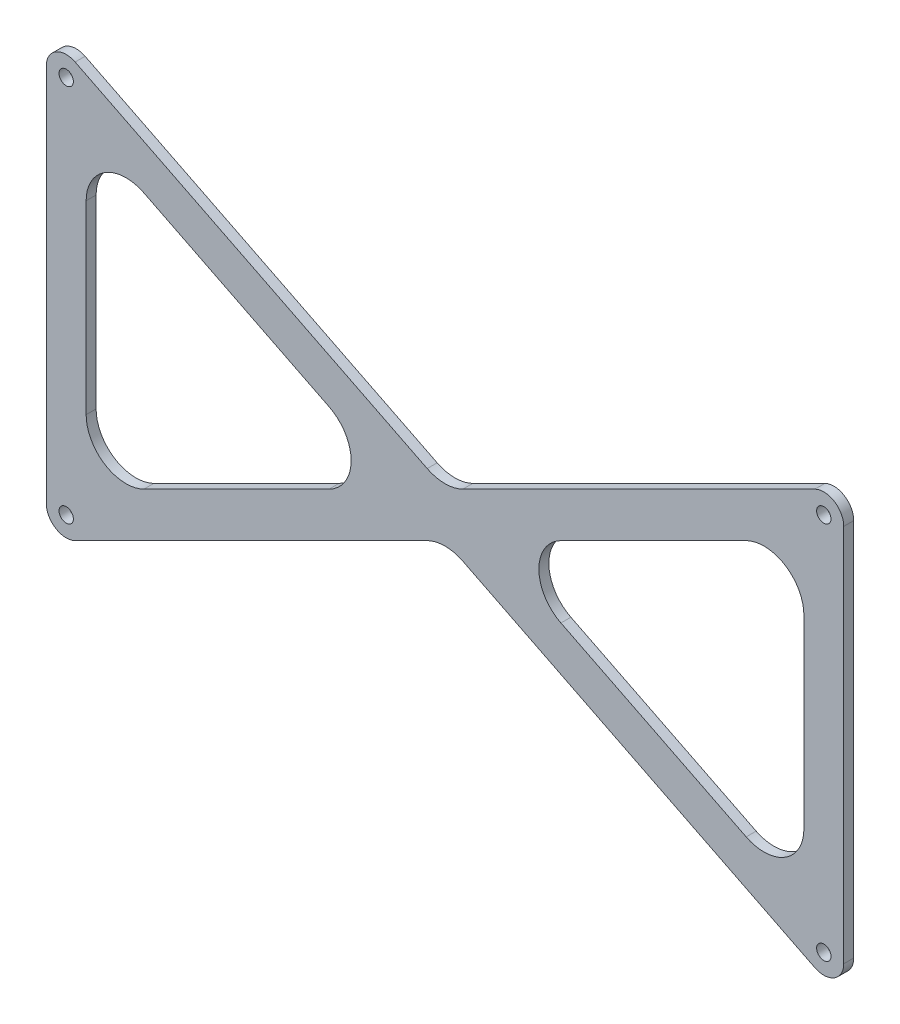
ISO-10303-21;
HEADER;
FILE_DESCRIPTION(('STEP AP214'),'2;1');
FILE_NAME('part.step','',(''),(''),'','','');
FILE_SCHEMA(('AUTOMOTIVE_DESIGN { 1 0 10303 214 1 1 1 1 }'));
ENDSEC;
DATA;
#1=APPLICATION_CONTEXT('core data for automotive mechanical design processes');
#2=APPLICATION_PROTOCOL_DEFINITION('international standard','automotive_design',2000,#1);
#3=PRODUCT_CONTEXT('',#1,'mechanical');
#4=PRODUCT('Part','Part','',(#3));
#5=PRODUCT_RELATED_PRODUCT_CATEGORY('part','',(#4));
#6=PRODUCT_DEFINITION_FORMATION('','',#4);
#7=PRODUCT_DEFINITION_CONTEXT('part definition',#1,'design');
#8=PRODUCT_DEFINITION('design','',#6,#7);
#9=PRODUCT_DEFINITION_SHAPE('','',#8);
#10=(LENGTH_UNIT() NAMED_UNIT(*) SI_UNIT(.MILLI.,.METRE.));
#11=(NAMED_UNIT(*) PLANE_ANGLE_UNIT() SI_UNIT($,.RADIAN.));
#12=(NAMED_UNIT(*) SI_UNIT($,.STERADIAN.) SOLID_ANGLE_UNIT());
#13=UNCERTAINTY_MEASURE_WITH_UNIT(LENGTH_MEASURE(1.E-05),#10,'distance_accuracy_value','');
#14=(GEOMETRIC_REPRESENTATION_CONTEXT(3) GLOBAL_UNCERTAINTY_ASSIGNED_CONTEXT((#13)) GLOBAL_UNIT_ASSIGNED_CONTEXT((#10,
#11,#12)) REPRESENTATION_CONTEXT('',''));
#15=CARTESIAN_POINT('',(0.,0.,0.));
#16=DIRECTION('',(0.,0.,1.));
#17=DIRECTION('',(1.,0.,0.));
#18=AXIS2_PLACEMENT_3D('',#15,#16,#17);
#19=CARTESIAN_POINT('',(120.65,60.325,3.175));
#20=DIRECTION('',(0.,0.,1.));
#21=DIRECTION('',(1.,0.,0.));
#22=AXIS2_PLACEMENT_3D('',#19,#20,#21);
#23=PLANE('',#22);
#24=CARTESIAN_POINT('',(120.65,60.325,3.175));
#25=DIRECTION('',(0.,0.,1.));
#26=DIRECTION('',(1.,0.,0.));
#27=AXIS2_PLACEMENT_3D('',#24,#25,#26);
#28=CIRCLE('',#27,2.28599999999999);
#29=CARTESIAN_POINT('',(122.936,60.325,3.175));
#30=VERTEX_POINT('',#29);
#31=EDGE_CURVE('E767',#30,#30,#28,.T.);
#32=ORIENTED_EDGE('',*,*,#31,.F.);
#33=EDGE_LOOP('',(#32));
#34=FACE_BOUND('',#33,.T.);
#35=CARTESIAN_POINT('',(120.65,-60.325,3.175));
#36=DIRECTION('',(0.,0.,1.));
#37=DIRECTION('',(1.,0.,0.));
#38=AXIS2_PLACEMENT_3D('',#35,#36,#37);
#39=CIRCLE('',#38,2.28599999999999);
#40=CARTESIAN_POINT('',(122.936,-60.325,3.175));
#41=VERTEX_POINT('',#40);
#42=EDGE_CURVE('E772',#41,#41,#39,.T.);
#43=ORIENTED_EDGE('',*,*,#42,.F.);
#44=EDGE_LOOP('',(#43));
#45=FACE_BOUND('',#44,.T.);
#46=CARTESIAN_POINT('',(-120.65,-60.325,3.175));
#47=DIRECTION('',(0.,0.,1.));
#48=DIRECTION('',(1.,0.,0.));
#49=AXIS2_PLACEMENT_3D('',#46,#47,#48);
#50=CIRCLE('',#49,2.28599999999999);
#51=CARTESIAN_POINT('',(-118.364,-60.325,3.175));
#52=VERTEX_POINT('',#51);
#53=EDGE_CURVE('E780',#52,#52,#50,.T.);
#54=ORIENTED_EDGE('',*,*,#53,.F.);
#55=EDGE_LOOP('',(#54));
#56=FACE_BOUND('',#55,.T.);
#57=CARTESIAN_POINT('',(-120.65,60.325,3.175));
#58=DIRECTION('',(0.,0.,1.));
#59=DIRECTION('',(1.,0.,0.));
#60=AXIS2_PLACEMENT_3D('',#57,#58,#59);
#61=CIRCLE('',#60,2.28599999999999);
#62=CARTESIAN_POINT('',(-118.364,60.325,3.175));
#63=VERTEX_POINT('',#62);
#64=EDGE_CURVE('E336',#63,#63,#61,.T.);
#65=ORIENTED_EDGE('',*,*,#64,.F.);
#66=EDGE_LOOP('',(#65));
#67=FACE_BOUND('',#66,.T.);
#68=CARTESIAN_POINT('',(120.65,60.325,3.175));
#69=DIRECTION('',(0.,0.,1.));
#70=DIRECTION('',(1.,0.,0.));
#71=AXIS2_PLACEMENT_3D('',#68,#69,#70);
#72=CIRCLE('',#71,6.34999999999999);
#73=CARTESIAN_POINT('',(127.,60.325,3.175));
#74=VERTEX_POINT('',#73);
#75=CARTESIAN_POINT('',(117.810193668575,66.0046126628494,3.175));
#76=VERTEX_POINT('',#75);
#77=EDGE_CURVE('E224',#74,#76,#72,.T.);
#78=ORIENTED_EDGE('',*,*,#77,.T.);
#79=DIRECTION('',(-0.894427190999916,-0.447213595499958,0.));
#80=VECTOR('',#79,1.);
#81=CARTESIAN_POINT('',(0.,7.09951582856184,3.175));
#82=LINE('',#81,#80);
#83=CARTESIAN_POINT('',(5.67961266284947,9.93932215998657,3.175));
#84=VERTEX_POINT('',#83);
#85=EDGE_CURVE('E212',#76,#84,#82,.T.);
#86=ORIENTED_EDGE('',*,*,#85,.T.);
#87=CARTESIAN_POINT('',(0.,21.2985474856855,3.175));
#88=DIRECTION('',(0.,0.,1.));
#89=DIRECTION('',(1.,0.,0.));
#90=AXIS2_PLACEMENT_3D('',#87,#88,#89);
#91=CIRCLE('',#90,12.7);
#92=CARTESIAN_POINT('',(-5.67961266284944,9.93932215998657,3.175));
#93=VERTEX_POINT('',#92);
#94=EDGE_CURVE('E285',#84,#93,#91,.F.);
#95=ORIENTED_EDGE('',*,*,#94,.T.);
#96=DIRECTION('',(-0.894427190999916,0.447213595499958,0.));
#97=VECTOR('',#96,1.);
#98=CARTESIAN_POINT('',(-117.810193668575,66.0046126628495,3.175));
#99=LINE('',#98,#97);
#100=CARTESIAN_POINT('',(-117.810193668575,66.0046126628495,3.175));
#101=VERTEX_POINT('',#100);
#102=EDGE_CURVE('E223',#93,#101,#99,.T.);
#103=ORIENTED_EDGE('',*,*,#102,.T.);
#104=CARTESIAN_POINT('',(-120.65,60.325,3.175));
#105=DIRECTION('',(0.,0.,1.));
#106=DIRECTION('',(1.,0.,0.));
#107=AXIS2_PLACEMENT_3D('',#104,#105,#106);
#108=CIRCLE('',#107,6.35);
#109=CARTESIAN_POINT('',(-127.,60.325,3.175));
#110=VERTEX_POINT('',#109);
#111=EDGE_CURVE('E364',#101,#110,#108,.T.);
#112=ORIENTED_EDGE('',*,*,#111,.T.);
#113=DIRECTION('',(0.,-1.,0.));
#114=VECTOR('',#113,1.);
#115=CARTESIAN_POINT('',(-127.,60.325,3.175));
#116=LINE('',#115,#114);
#117=CARTESIAN_POINT('',(-127.,-60.325,3.175));
#118=VERTEX_POINT('',#117);
#119=EDGE_CURVE('E366',#110,#118,#116,.T.);
#120=ORIENTED_EDGE('',*,*,#119,.T.);
#121=CARTESIAN_POINT('',(-120.65,-60.325,3.175));
#122=DIRECTION('',(0.,0.,1.));
#123=DIRECTION('',(1.,0.,0.));
#124=AXIS2_PLACEMENT_3D('',#121,#122,#123);
#125=CIRCLE('',#124,6.34999999999998);
#126=CARTESIAN_POINT('',(-117.810193668575,-66.0046126628494,3.175));
#127=VERTEX_POINT('',#126);
#128=EDGE_CURVE('E369',#118,#127,#125,.T.);
#129=ORIENTED_EDGE('',*,*,#128,.T.);
#130=DIRECTION('',(0.894427190999916,0.447213595499958,0.));
#131=VECTOR('',#130,1.);
#132=CARTESIAN_POINT('',(-117.810193668575,-66.0046126628495,3.175));
#133=LINE('',#132,#131);
#134=CARTESIAN_POINT('',(-5.67961266284943,-9.93932215998656,3.175));
#135=VERTEX_POINT('',#134);
#136=EDGE_CURVE('E372',#127,#135,#133,.T.);
#137=ORIENTED_EDGE('',*,*,#136,.T.);
#138=CARTESIAN_POINT('',(0.,-21.2985474856855,3.175));
#139=DIRECTION('',(0.,0.,1.));
#140=DIRECTION('',(1.,0.,0.));
#141=AXIS2_PLACEMENT_3D('',#138,#139,#140);
#142=CIRCLE('',#141,12.7);
#143=CARTESIAN_POINT('',(5.67961266284949,-9.93932215998657,3.175));
#144=VERTEX_POINT('',#143);
#145=EDGE_CURVE('E289',#135,#144,#142,.F.);
#146=ORIENTED_EDGE('',*,*,#145,.T.);
#147=DIRECTION('',(0.894427190999916,-0.447213595499958,0.));
#148=VECTOR('',#147,1.);
#149=CARTESIAN_POINT('',(0.,-7.09951582856183,3.175));
#150=LINE('',#149,#148);
#151=CARTESIAN_POINT('',(117.810193668575,-66.0046126628495,3.175));
#152=VERTEX_POINT('',#151);
#153=EDGE_CURVE('E376',#144,#152,#150,.T.);
#154=ORIENTED_EDGE('',*,*,#153,.T.);
#155=CARTESIAN_POINT('',(120.65,-60.325,3.175));
#156=DIRECTION('',(0.,0.,1.));
#157=DIRECTION('',(1.,0.,0.));
#158=AXIS2_PLACEMENT_3D('',#155,#156,#157);
#159=CIRCLE('',#158,6.35000000000001);
#160=CARTESIAN_POINT('',(127.,-60.325,3.175));
#161=VERTEX_POINT('',#160);
#162=EDGE_CURVE('E379',#152,#161,#159,.T.);
#163=ORIENTED_EDGE('',*,*,#162,.T.);
#164=DIRECTION('',(0.,1.,0.));
#165=VECTOR('',#164,1.);
#166=CARTESIAN_POINT('',(127.,60.325,3.175));
#167=LINE('',#166,#165);
#168=EDGE_CURVE('E229',#161,#74,#167,.T.);
#169=ORIENTED_EDGE('',*,*,#168,.T.);
#170=EDGE_LOOP('',(#78,#86,#95,#103,#112,#120,#129,#137,#146,#154,#163,#169));
#171=FACE_BOUND('',#170,.T.);
#172=DIRECTION('',(-0.894427190999916,-0.447213595499958,0.));
#173=VECTOR('',#172,1.);
#174=CARTESIAN_POINT('',(14.1990316571237,0.,3.175));
#175=LINE('',#174,#173);
#176=CARTESIAN_POINT('',(95.9203873371505,40.8606778400134,3.175));
#177=VERTEX_POINT('',#176);
#178=CARTESIAN_POINT('',(36.9174823085215,11.3592253256989,3.175));
#179=VERTEX_POINT('',#178);
#180=EDGE_CURVE('E347',#177,#179,#175,.T.);
#181=ORIENTED_EDGE('',*,*,#180,.F.);
#182=CARTESIAN_POINT('',(101.6,29.5014525143145,3.175));
#183=DIRECTION('',(0.,0.,1.));
#184=DIRECTION('',(1.,0.,0.));
#185=AXIS2_PLACEMENT_3D('',#182,#183,#184);
#186=CIRCLE('',#185,12.7);
#187=CARTESIAN_POINT('',(114.3,29.5014525143145,3.175));
#188=VERTEX_POINT('',#187);
#189=EDGE_CURVE('E297',#177,#188,#186,.F.);
#190=ORIENTED_EDGE('',*,*,#189,.T.);
#191=DIRECTION('',(0.,1.,0.));
#192=VECTOR('',#191,1.);
#193=CARTESIAN_POINT('',(114.3,50.0504841714381,3.175));
#194=LINE('',#193,#192);
#195=CARTESIAN_POINT('',(114.3,-29.5014525143145,3.175));
#196=VERTEX_POINT('',#195);
#197=EDGE_CURVE('E344',#196,#188,#194,.T.);
#198=ORIENTED_EDGE('',*,*,#197,.F.);
#199=CARTESIAN_POINT('',(101.6,-29.5014525143145,3.175));
#200=DIRECTION('',(0.,0.,1.));
#201=DIRECTION('',(1.,0.,0.));
#202=AXIS2_PLACEMENT_3D('',#199,#200,#201);
#203=CIRCLE('',#202,12.7);
#204=CARTESIAN_POINT('',(95.9203873371505,-40.8606778400135,3.175));
#205=VERTEX_POINT('',#204);
#206=EDGE_CURVE('E293',#196,#205,#203,.F.);
#207=ORIENTED_EDGE('',*,*,#206,.T.);
#208=DIRECTION('',(0.894427190999916,-0.447213595499958,0.));
#209=VECTOR('',#208,1.);
#210=CARTESIAN_POINT('',(14.1990316571237,0.,3.175));
#211=LINE('',#210,#209);
#212=CARTESIAN_POINT('',(36.9174823085215,-11.3592253256989,3.175));
#213=VERTEX_POINT('',#212);
#214=EDGE_CURVE('E351',#213,#205,#211,.T.);
#215=ORIENTED_EDGE('',*,*,#214,.F.);
#216=CARTESIAN_POINT('',(42.597094971371,0.,3.175));
#217=DIRECTION('',(0.,0.,1.));
#218=DIRECTION('',(1.,0.,0.));
#219=AXIS2_PLACEMENT_3D('',#216,#217,#218);
#220=CIRCLE('',#219,12.7);
#221=EDGE_CURVE('E301',#213,#179,#220,.F.);
#222=ORIENTED_EDGE('',*,*,#221,.T.);
#223=EDGE_LOOP('',(#181,#190,#198,#207,#215,#222));
#224=FACE_BOUND('',#223,.T.);
#225=DIRECTION('',(0.,-1.,0.));
#226=VECTOR('',#225,1.);
#227=CARTESIAN_POINT('',(-114.3,50.0504841714382,3.175));
#228=LINE('',#227,#226);
#229=CARTESIAN_POINT('',(-114.3,29.5014525143145,3.175));
#230=VERTEX_POINT('',#229);
#231=CARTESIAN_POINT('',(-114.3,-29.5014525143145,3.175));
#232=VERTEX_POINT('',#231);
#233=EDGE_CURVE('E330',#230,#232,#228,.T.);
#234=ORIENTED_EDGE('',*,*,#233,.F.);
#235=CARTESIAN_POINT('',(-101.6,29.5014525143145,3.175));
#236=DIRECTION('',(0.,0.,1.));
#237=DIRECTION('',(1.,0.,0.));
#238=AXIS2_PLACEMENT_3D('',#235,#236,#237);
#239=CIRCLE('',#238,12.7);
#240=CARTESIAN_POINT('',(-95.9203873371505,40.8606778400135,3.175));
#241=VERTEX_POINT('',#240);
#242=EDGE_CURVE('E11',#230,#241,#239,.F.);
#243=ORIENTED_EDGE('',*,*,#242,.T.);
#244=DIRECTION('',(-0.894427190999916,0.447213595499958,0.));
#245=VECTOR('',#244,1.);
#246=CARTESIAN_POINT('',(-114.3,50.0504841714382,3.175));
#247=LINE('',#246,#245);
#248=CARTESIAN_POINT('',(-36.9174823085215,11.3592253256989,3.175));
#249=VERTEX_POINT('',#248);
#250=EDGE_CURVE('E328',#249,#241,#247,.T.);
#251=ORIENTED_EDGE('',*,*,#250,.F.);
#252=CARTESIAN_POINT('',(-42.597094971371,0.,3.175));
#253=DIRECTION('',(0.,0.,1.));
#254=DIRECTION('',(1.,0.,0.));
#255=AXIS2_PLACEMENT_3D('',#252,#253,#254);
#256=CIRCLE('',#255,12.7);
#257=CARTESIAN_POINT('',(-36.9174823085215,-11.3592253256989,3.175));
#258=VERTEX_POINT('',#257);
#259=EDGE_CURVE('E309',#249,#258,#256,.F.);
#260=ORIENTED_EDGE('',*,*,#259,.T.);
#261=DIRECTION('',(0.894427190999916,0.447213595499958,0.));
#262=VECTOR('',#261,1.);
#263=CARTESIAN_POINT('',(-114.3,-50.0504841714381,3.175));
#264=LINE('',#263,#262);
#265=CARTESIAN_POINT('',(-95.9203873371505,-40.8606778400134,3.175));
#266=VERTEX_POINT('',#265);
#267=EDGE_CURVE('E332',#266,#258,#264,.T.);
#268=ORIENTED_EDGE('',*,*,#267,.F.);
#269=CARTESIAN_POINT('',(-101.6,-29.5014525143145,3.175));
#270=DIRECTION('',(0.,0.,1.));
#271=DIRECTION('',(1.,0.,0.));
#272=AXIS2_PLACEMENT_3D('',#269,#270,#271);
#273=CIRCLE('',#272,12.7);
#274=EDGE_CURVE('E305',#266,#232,#273,.F.);
#275=ORIENTED_EDGE('',*,*,#274,.T.);
#276=EDGE_LOOP('',(#234,#243,#251,#260,#268,#275));
#277=FACE_BOUND('',#276,.T.);
#278=ADVANCED_FACE('F43',(#34,#45,#56,#67,#171,#224,#277),#23,.T.);
#279=CARTESIAN_POINT('',(120.65,60.325,0.));
#280=DIRECTION('',(0.,0.,1.));
#281=DIRECTION('',(1.,0.,0.));
#282=AXIS2_PLACEMENT_3D('',#279,#280,#281);
#283=PLANE('',#282);
#284=CARTESIAN_POINT('',(120.65,60.325,0.));
#285=DIRECTION('',(0.,0.,1.));
#286=DIRECTION('',(1.,0.,0.));
#287=AXIS2_PLACEMENT_3D('',#284,#285,#286);
#288=CIRCLE('',#287,2.28599999999999);
#289=CARTESIAN_POINT('',(122.936,60.325,0.));
#290=VERTEX_POINT('',#289);
#291=EDGE_CURVE('E765',#290,#290,#288,.T.);
#292=ORIENTED_EDGE('',*,*,#291,.T.);
#293=EDGE_LOOP('',(#292));
#294=FACE_BOUND('',#293,.T.);
#295=CARTESIAN_POINT('',(120.65,-60.325,0.));
#296=DIRECTION('',(0.,0.,1.));
#297=DIRECTION('',(1.,0.,0.));
#298=AXIS2_PLACEMENT_3D('',#295,#296,#297);
#299=CIRCLE('',#298,2.28599999999999);
#300=CARTESIAN_POINT('',(122.936,-60.325,0.));
#301=VERTEX_POINT('',#300);
#302=EDGE_CURVE('E768',#301,#301,#299,.T.);
#303=ORIENTED_EDGE('',*,*,#302,.T.);
#304=EDGE_LOOP('',(#303));
#305=FACE_BOUND('',#304,.T.);
#306=CARTESIAN_POINT('',(-120.65,-60.325,0.));
#307=DIRECTION('',(0.,0.,1.));
#308=DIRECTION('',(1.,0.,0.));
#309=AXIS2_PLACEMENT_3D('',#306,#307,#308);
#310=CIRCLE('',#309,2.28599999999999);
#311=CARTESIAN_POINT('',(-118.364,-60.325,0.));
#312=VERTEX_POINT('',#311);
#313=EDGE_CURVE('E785',#312,#312,#310,.T.);
#314=ORIENTED_EDGE('',*,*,#313,.T.);
#315=EDGE_LOOP('',(#314));
#316=FACE_BOUND('',#315,.T.);
#317=CARTESIAN_POINT('',(-120.65,60.325,0.));
#318=DIRECTION('',(0.,0.,1.));
#319=DIRECTION('',(1.,0.,0.));
#320=AXIS2_PLACEMENT_3D('',#317,#318,#319);
#321=CIRCLE('',#320,2.28599999999999);
#322=CARTESIAN_POINT('',(-118.364,60.325,0.));
#323=VERTEX_POINT('',#322);
#324=EDGE_CURVE('E342',#323,#323,#321,.T.);
#325=ORIENTED_EDGE('',*,*,#324,.T.);
#326=EDGE_LOOP('',(#325));
#327=FACE_BOUND('',#326,.T.);
#328=DIRECTION('',(0.894427190999916,-0.447213595499958,0.));
#329=VECTOR('',#328,1.);
#330=CARTESIAN_POINT('',(14.1990316571237,0.,0.));
#331=LINE('',#330,#329);
#332=CARTESIAN_POINT('',(36.9174823085215,-11.3592253256989,0.));
#333=VERTEX_POINT('',#332);
#334=CARTESIAN_POINT('',(95.9203873371505,-40.8606778400135,0.));
#335=VERTEX_POINT('',#334);
#336=EDGE_CURVE('E348',#333,#335,#331,.T.);
#337=ORIENTED_EDGE('',*,*,#336,.T.);
#338=CARTESIAN_POINT('',(101.6,-29.5014525143145,0.));
#339=DIRECTION('',(0.,0.,1.));
#340=DIRECTION('',(1.,0.,0.));
#341=AXIS2_PLACEMENT_3D('',#338,#339,#340);
#342=CIRCLE('',#341,12.7);
#343=CARTESIAN_POINT('',(114.3,-29.5014525143145,0.));
#344=VERTEX_POINT('',#343);
#345=EDGE_CURVE('E291',#335,#344,#342,.T.);
#346=ORIENTED_EDGE('',*,*,#345,.T.);
#347=DIRECTION('',(0.,1.,0.));
#348=VECTOR('',#347,1.);
#349=CARTESIAN_POINT('',(114.3,50.0504841714381,0.));
#350=LINE('',#349,#348);
#351=CARTESIAN_POINT('',(114.3,29.5014525143145,0.));
#352=VERTEX_POINT('',#351);
#353=EDGE_CURVE('E341',#344,#352,#350,.T.);
#354=ORIENTED_EDGE('',*,*,#353,.T.);
#355=CARTESIAN_POINT('',(101.6,29.5014525143145,0.));
#356=DIRECTION('',(0.,0.,1.));
#357=DIRECTION('',(1.,0.,0.));
#358=AXIS2_PLACEMENT_3D('',#355,#356,#357);
#359=CIRCLE('',#358,12.7);
#360=CARTESIAN_POINT('',(95.9203873371505,40.8606778400134,0.));
#361=VERTEX_POINT('',#360);
#362=EDGE_CURVE('E295',#352,#361,#359,.T.);
#363=ORIENTED_EDGE('',*,*,#362,.T.);
#364=DIRECTION('',(-0.894427190999916,-0.447213595499958,0.));
#365=VECTOR('',#364,1.);
#366=CARTESIAN_POINT('',(14.1990316571237,0.,0.));
#367=LINE('',#366,#365);
#368=CARTESIAN_POINT('',(36.9174823085215,11.3592253256989,0.));
#369=VERTEX_POINT('',#368);
#370=EDGE_CURVE('E357',#361,#369,#367,.T.);
#371=ORIENTED_EDGE('',*,*,#370,.T.);
#372=CARTESIAN_POINT('',(42.597094971371,0.,0.));
#373=DIRECTION('',(0.,0.,1.));
#374=DIRECTION('',(1.,0.,0.));
#375=AXIS2_PLACEMENT_3D('',#372,#373,#374);
#376=CIRCLE('',#375,12.7);
#377=EDGE_CURVE('E299',#369,#333,#376,.T.);
#378=ORIENTED_EDGE('',*,*,#377,.T.);
#379=EDGE_LOOP('',(#337,#346,#354,#363,#371,#378));
#380=FACE_BOUND('',#379,.T.);
#381=CARTESIAN_POINT('',(120.65,60.325,0.));
#382=DIRECTION('',(0.,0.,1.));
#383=DIRECTION('',(1.,0.,0.));
#384=AXIS2_PLACEMENT_3D('',#381,#382,#383);
#385=CIRCLE('',#384,6.34999999999999);
#386=CARTESIAN_POINT('',(127.,60.325,0.));
#387=VERTEX_POINT('',#386);
#388=CARTESIAN_POINT('',(117.810193668575,66.0046126628494,0.));
#389=VERTEX_POINT('',#388);
#390=EDGE_CURVE('E237',#387,#389,#385,.T.);
#391=ORIENTED_EDGE('',*,*,#390,.F.);
#392=DIRECTION('',(0.,1.,0.));
#393=VECTOR('',#392,1.);
#394=CARTESIAN_POINT('',(127.,60.325,0.));
#395=LINE('',#394,#393);
#396=CARTESIAN_POINT('',(127.,-60.325,0.));
#397=VERTEX_POINT('',#396);
#398=EDGE_CURVE('E233',#397,#387,#395,.T.);
#399=ORIENTED_EDGE('',*,*,#398,.F.);
#400=CARTESIAN_POINT('',(120.65,-60.325,0.));
#401=DIRECTION('',(0.,0.,1.));
#402=DIRECTION('',(1.,0.,0.));
#403=AXIS2_PLACEMENT_3D('',#400,#401,#402);
#404=CIRCLE('',#403,6.35000000000001);
#405=CARTESIAN_POINT('',(117.810193668575,-66.0046126628495,0.));
#406=VERTEX_POINT('',#405);
#407=EDGE_CURVE('E405',#406,#397,#404,.T.);
#408=ORIENTED_EDGE('',*,*,#407,.F.);
#409=DIRECTION('',(0.894427190999916,-0.447213595499958,0.));
#410=VECTOR('',#409,1.);
#411=CARTESIAN_POINT('',(0.,-7.09951582856183,0.));
#412=LINE('',#411,#410);
#413=CARTESIAN_POINT('',(5.67961266284949,-9.93932215998657,0.));
#414=VERTEX_POINT('',#413);
#415=EDGE_CURVE('E402',#414,#406,#412,.T.);
#416=ORIENTED_EDGE('',*,*,#415,.F.);
#417=CARTESIAN_POINT('',(0.,-21.2985474856855,0.));
#418=DIRECTION('',(0.,0.,1.));
#419=DIRECTION('',(1.,0.,0.));
#420=AXIS2_PLACEMENT_3D('',#417,#418,#419);
#421=CIRCLE('',#420,12.7);
#422=CARTESIAN_POINT('',(-5.67961266284943,-9.93932215998656,0.));
#423=VERTEX_POINT('',#422);
#424=EDGE_CURVE('E287',#414,#423,#421,.T.);
#425=ORIENTED_EDGE('',*,*,#424,.T.);
#426=DIRECTION('',(0.894427190999916,0.447213595499958,0.));
#427=VECTOR('',#426,1.);
#428=CARTESIAN_POINT('',(-117.810193668575,-66.0046126628495,0.));
#429=LINE('',#428,#427);
#430=CARTESIAN_POINT('',(-117.810193668575,-66.0046126628494,0.));
#431=VERTEX_POINT('',#430);
#432=EDGE_CURVE('E398',#431,#423,#429,.T.);
#433=ORIENTED_EDGE('',*,*,#432,.F.);
#434=CARTESIAN_POINT('',(-120.65,-60.325,0.));
#435=DIRECTION('',(0.,0.,1.));
#436=DIRECTION('',(1.,0.,0.));
#437=AXIS2_PLACEMENT_3D('',#434,#435,#436);
#438=CIRCLE('',#437,6.34999999999998);
#439=CARTESIAN_POINT('',(-127.,-60.325,0.));
#440=VERTEX_POINT('',#439);
#441=EDGE_CURVE('E395',#440,#431,#438,.T.);
#442=ORIENTED_EDGE('',*,*,#441,.F.);
#443=DIRECTION('',(0.,-1.,0.));
#444=VECTOR('',#443,1.);
#445=CARTESIAN_POINT('',(-127.,60.325,0.));
#446=LINE('',#445,#444);
#447=CARTESIAN_POINT('',(-127.,60.325,0.));
#448=VERTEX_POINT('',#447);
#449=EDGE_CURVE('E392',#448,#440,#446,.T.);
#450=ORIENTED_EDGE('',*,*,#449,.F.);
#451=CARTESIAN_POINT('',(-120.65,60.325,0.));
#452=DIRECTION('',(0.,0.,1.));
#453=DIRECTION('',(1.,0.,0.));
#454=AXIS2_PLACEMENT_3D('',#451,#452,#453);
#455=CIRCLE('',#454,6.35);
#456=CARTESIAN_POINT('',(-117.810193668575,66.0046126628495,0.));
#457=VERTEX_POINT('',#456);
#458=EDGE_CURVE('E390',#457,#448,#455,.T.);
#459=ORIENTED_EDGE('',*,*,#458,.F.);
#460=DIRECTION('',(-0.894427190999916,0.447213595499958,0.));
#461=VECTOR('',#460,1.);
#462=CARTESIAN_POINT('',(-117.810193668575,66.0046126628495,0.));
#463=LINE('',#462,#461);
#464=CARTESIAN_POINT('',(-5.67961266284944,9.93932215998657,0.));
#465=VERTEX_POINT('',#464);
#466=EDGE_CURVE('E388',#465,#457,#463,.T.);
#467=ORIENTED_EDGE('',*,*,#466,.F.);
#468=CARTESIAN_POINT('',(0.,21.2985474856855,0.));
#469=DIRECTION('',(0.,0.,1.));
#470=DIRECTION('',(1.,0.,0.));
#471=AXIS2_PLACEMENT_3D('',#468,#469,#470);
#472=CIRCLE('',#471,12.7);
#473=CARTESIAN_POINT('',(5.67961266284947,9.93932215998657,0.));
#474=VERTEX_POINT('',#473);
#475=EDGE_CURVE('E283',#465,#474,#472,.T.);
#476=ORIENTED_EDGE('',*,*,#475,.T.);
#477=DIRECTION('',(-0.894427190999916,-0.447213595499958,0.));
#478=VECTOR('',#477,1.);
#479=CARTESIAN_POINT('',(0.,7.09951582856184,0.));
#480=LINE('',#479,#478);
#481=EDGE_CURVE('E386',#389,#474,#480,.T.);
#482=ORIENTED_EDGE('',*,*,#481,.F.);
#483=EDGE_LOOP('',(#391,#399,#408,#416,#425,#433,#442,#450,#459,#467,#476,#482));
#484=FACE_BOUND('',#483,.T.);
#485=DIRECTION('',(0.894427190999916,0.447213595499958,0.));
#486=VECTOR('',#485,1.);
#487=CARTESIAN_POINT('',(-114.3,-50.0504841714381,0.));
#488=LINE('',#487,#486);
#489=CARTESIAN_POINT('',(-95.9203873371505,-40.8606778400134,0.));
#490=VERTEX_POINT('',#489);
#491=CARTESIAN_POINT('',(-36.9174823085215,-11.3592253256989,0.));
#492=VERTEX_POINT('',#491);
#493=EDGE_CURVE('E325',#490,#492,#488,.T.);
#494=ORIENTED_EDGE('',*,*,#493,.T.);
#495=CARTESIAN_POINT('',(-42.597094971371,0.,0.));
#496=DIRECTION('',(0.,0.,1.));
#497=DIRECTION('',(1.,0.,0.));
#498=AXIS2_PLACEMENT_3D('',#495,#496,#497);
#499=CIRCLE('',#498,12.7);
#500=CARTESIAN_POINT('',(-36.9174823085215,11.3592253256989,0.));
#501=VERTEX_POINT('',#500);
#502=EDGE_CURVE('E307',#492,#501,#499,.T.);
#503=ORIENTED_EDGE('',*,*,#502,.T.);
#504=DIRECTION('',(-0.894427190999916,0.447213595499958,0.));
#505=VECTOR('',#504,1.);
#506=CARTESIAN_POINT('',(-114.3,50.0504841714382,0.));
#507=LINE('',#506,#505);
#508=CARTESIAN_POINT('',(-95.9203873371505,40.8606778400135,0.));
#509=VERTEX_POINT('',#508);
#510=EDGE_CURVE('E317',#501,#509,#507,.T.);
#511=ORIENTED_EDGE('',*,*,#510,.T.);
#512=CARTESIAN_POINT('',(-101.6,29.5014525143145,0.));
#513=DIRECTION('',(0.,0.,1.));
#514=DIRECTION('',(1.,0.,0.));
#515=AXIS2_PLACEMENT_3D('',#512,#513,#514);
#516=CIRCLE('',#515,12.7);
#517=CARTESIAN_POINT('',(-114.3,29.5014525143145,0.));
#518=VERTEX_POINT('',#517);
#519=EDGE_CURVE('E51',#509,#518,#516,.T.);
#520=ORIENTED_EDGE('',*,*,#519,.T.);
#521=DIRECTION('',(0.,-1.,0.));
#522=VECTOR('',#521,1.);
#523=CARTESIAN_POINT('',(-114.3,50.0504841714382,0.));
#524=LINE('',#523,#522);
#525=CARTESIAN_POINT('',(-114.3,-29.5014525143145,0.));
#526=VERTEX_POINT('',#525);
#527=EDGE_CURVE('E316',#518,#526,#524,.T.);
#528=ORIENTED_EDGE('',*,*,#527,.T.);
#529=CARTESIAN_POINT('',(-101.6,-29.5014525143145,0.));
#530=DIRECTION('',(0.,0.,1.));
#531=DIRECTION('',(1.,0.,0.));
#532=AXIS2_PLACEMENT_3D('',#529,#530,#531);
#533=CIRCLE('',#532,12.7);
#534=EDGE_CURVE('E303',#526,#490,#533,.T.);
#535=ORIENTED_EDGE('',*,*,#534,.T.);
#536=EDGE_LOOP('',(#494,#503,#511,#520,#528,#535));
#537=FACE_BOUND('',#536,.T.);
#538=ADVANCED_FACE('F315',(#294,#305,#316,#327,#380,#484,#537),#283,.F.);
#539=CARTESIAN_POINT('',(120.65,60.325,3.175));
#540=DIRECTION('',(0.,0.,-1.));
#541=DIRECTION('',(-1.,0.,0.));
#542=AXIS2_PLACEMENT_3D('',#539,#540,#541);
#543=CYLINDRICAL_SURFACE('',#542,6.34999999999999);
#544=ORIENTED_EDGE('',*,*,#390,.T.);
#545=DIRECTION('',(0.,0.,-1.));
#546=VECTOR('',#545,1.);
#547=CARTESIAN_POINT('',(117.810193668575,66.0046126628494,3.175));
#548=LINE('',#547,#546);
#549=EDGE_CURVE('E217',#76,#389,#548,.T.);
#550=ORIENTED_EDGE('',*,*,#549,.F.);
#551=ORIENTED_EDGE('',*,*,#77,.F.);
#552=DIRECTION('',(0.,0.,-1.));
#553=VECTOR('',#552,1.);
#554=CARTESIAN_POINT('',(127.,60.325,3.175));
#555=LINE('',#554,#553);
#556=EDGE_CURVE('E384',#74,#387,#555,.T.);
#557=ORIENTED_EDGE('',*,*,#556,.T.);
#558=EDGE_LOOP('',(#544,#550,#551,#557));
#559=FACE_BOUND('',#558,.T.);
#560=ADVANCED_FACE('F235',(#559),#543,.T.);
#561=CARTESIAN_POINT('',(0.,7.09951582856184,3.175));
#562=DIRECTION('',(0.447213595499958,-0.894427190999916,0.));
#563=DIRECTION('',(0.894427190999916,0.447213595499958,0.));
#564=AXIS2_PLACEMENT_3D('',#561,#562,#563);
#565=PLANE('',#564);
#566=ORIENTED_EDGE('',*,*,#481,.T.);
#567=DIRECTION('',(0.,0.,-1.));
#568=VECTOR('',#567,1.);
#569=CARTESIAN_POINT('',(5.67961266284947,9.93932215998657,3.175));
#570=LINE('',#569,#568);
#571=EDGE_CURVE('E220',#474,#84,#570,.F.);
#572=ORIENTED_EDGE('',*,*,#571,.T.);
#573=ORIENTED_EDGE('',*,*,#85,.F.);
#574=ORIENTED_EDGE('',*,*,#549,.T.);
#575=EDGE_LOOP('',(#566,#572,#573,#574));
#576=FACE_BOUND('',#575,.T.);
#577=ADVANCED_FACE('F215',(#576),#565,.F.);
#578=CARTESIAN_POINT('',(-117.810193668575,66.0046126628495,3.175));
#579=DIRECTION('',(-0.447213595499958,-0.894427190999916,0.));
#580=DIRECTION('',(0.894427190999916,-0.447213595499958,0.));
#581=AXIS2_PLACEMENT_3D('',#578,#579,#580);
#582=PLANE('',#581);
#583=ORIENTED_EDGE('',*,*,#102,.F.);
#584=DIRECTION('',(0.,0.,-1.));
#585=VECTOR('',#584,1.);
#586=CARTESIAN_POINT('',(-5.67961266284945,9.93932215998657,0.));
#587=LINE('',#586,#585);
#588=EDGE_CURVE('E238',#93,#465,#587,.T.);
#589=ORIENTED_EDGE('',*,*,#588,.T.);
#590=ORIENTED_EDGE('',*,*,#466,.T.);
#591=DIRECTION('',(0.,0.,-1.));
#592=VECTOR('',#591,1.);
#593=CARTESIAN_POINT('',(-117.810193668575,66.0046126628495,3.175));
#594=LINE('',#593,#592);
#595=EDGE_CURVE('E239',#101,#457,#594,.T.);
#596=ORIENTED_EDGE('',*,*,#595,.F.);
#597=EDGE_LOOP('',(#583,#589,#590,#596));
#598=FACE_BOUND('',#597,.T.);
#599=ADVANCED_FACE('F471',(#598),#582,.F.);
#600=CARTESIAN_POINT('',(-120.65,60.325,3.175));
#601=DIRECTION('',(0.,0.,-1.));
#602=DIRECTION('',(-1.,0.,0.));
#603=AXIS2_PLACEMENT_3D('',#600,#601,#602);
#604=CYLINDRICAL_SURFACE('',#603,6.35);
#605=ORIENTED_EDGE('',*,*,#458,.T.);
#606=DIRECTION('',(0.,0.,-1.));
#607=VECTOR('',#606,1.);
#608=CARTESIAN_POINT('',(-127.,60.325,3.175));
#609=LINE('',#608,#607);
#610=EDGE_CURVE('E244',#110,#448,#609,.T.);
#611=ORIENTED_EDGE('',*,*,#610,.F.);
#612=ORIENTED_EDGE('',*,*,#111,.F.);
#613=ORIENTED_EDGE('',*,*,#595,.T.);
#614=EDGE_LOOP('',(#605,#611,#612,#613));
#615=FACE_BOUND('',#614,.T.);
#616=ADVANCED_FACE('F472',(#615),#604,.T.);
#617=CARTESIAN_POINT('',(-127.,60.325,3.175));
#618=DIRECTION('',(1.,0.,0.));
#619=DIRECTION('',(0.,1.,0.));
#620=AXIS2_PLACEMENT_3D('',#617,#618,#619);
#621=PLANE('',#620);
#622=ORIENTED_EDGE('',*,*,#449,.T.);
#623=DIRECTION('',(0.,0.,-1.));
#624=VECTOR('',#623,1.);
#625=CARTESIAN_POINT('',(-127.,-60.325,3.175));
#626=LINE('',#625,#624);
#627=EDGE_CURVE('E423',#118,#440,#626,.T.);
#628=ORIENTED_EDGE('',*,*,#627,.F.);
#629=ORIENTED_EDGE('',*,*,#119,.F.);
#630=ORIENTED_EDGE('',*,*,#610,.T.);
#631=EDGE_LOOP('',(#622,#628,#629,#630));
#632=FACE_BOUND('',#631,.T.);
#633=ADVANCED_FACE('F431',(#632),#621,.F.);
#634=CARTESIAN_POINT('',(-120.65,-60.325,3.175));
#635=DIRECTION('',(0.,0.,-1.));
#636=DIRECTION('',(-1.,0.,0.));
#637=AXIS2_PLACEMENT_3D('',#634,#635,#636);
#638=CYLINDRICAL_SURFACE('',#637,6.34999999999998);
#639=ORIENTED_EDGE('',*,*,#441,.T.);
#640=DIRECTION('',(0.,0.,-1.));
#641=VECTOR('',#640,1.);
#642=CARTESIAN_POINT('',(-117.810193668575,-66.0046126628494,3.175));
#643=LINE('',#642,#641);
#644=EDGE_CURVE('E419',#127,#431,#643,.T.);
#645=ORIENTED_EDGE('',*,*,#644,.F.);
#646=ORIENTED_EDGE('',*,*,#128,.F.);
#647=ORIENTED_EDGE('',*,*,#627,.T.);
#648=EDGE_LOOP('',(#639,#645,#646,#647));
#649=FACE_BOUND('',#648,.T.);
#650=ADVANCED_FACE('F442',(#649),#638,.T.);
#651=CARTESIAN_POINT('',(-117.810193668575,-66.0046126628495,3.175));
#652=DIRECTION('',(-0.447213595499958,0.894427190999916,0.));
#653=DIRECTION('',(-0.894427190999916,-0.447213595499958,0.));
#654=AXIS2_PLACEMENT_3D('',#651,#652,#653);
#655=PLANE('',#654);
#656=ORIENTED_EDGE('',*,*,#432,.T.);
#657=DIRECTION('',(0.,0.,-1.));
#658=VECTOR('',#657,1.);
#659=CARTESIAN_POINT('',(-5.67961266284944,-9.93932215998657,3.175));
#660=LINE('',#659,#658);
#661=EDGE_CURVE('E252',#423,#135,#660,.F.);
#662=ORIENTED_EDGE('',*,*,#661,.T.);
#663=ORIENTED_EDGE('',*,*,#136,.F.);
#664=ORIENTED_EDGE('',*,*,#644,.T.);
#665=EDGE_LOOP('',(#656,#662,#663,#664));
#666=FACE_BOUND('',#665,.T.);
#667=ADVANCED_FACE('F446',(#666),#655,.F.);
#668=CARTESIAN_POINT('',(0.,-7.09951582856183,3.175));
#669=DIRECTION('',(0.447213595499958,0.894427190999916,0.));
#670=DIRECTION('',(-0.894427190999916,0.447213595499958,0.));
#671=AXIS2_PLACEMENT_3D('',#668,#669,#670);
#672=PLANE('',#671);
#673=ORIENTED_EDGE('',*,*,#153,.F.);
#674=DIRECTION('',(0.,0.,-1.));
#675=VECTOR('',#674,1.);
#676=CARTESIAN_POINT('',(5.67961266284949,-9.93932215998657,0.));
#677=LINE('',#676,#675);
#678=EDGE_CURVE('E249',#144,#414,#677,.T.);
#679=ORIENTED_EDGE('',*,*,#678,.T.);
#680=ORIENTED_EDGE('',*,*,#415,.T.);
#681=DIRECTION('',(0.,0.,-1.));
#682=VECTOR('',#681,1.);
#683=CARTESIAN_POINT('',(117.810193668575,-66.0046126628495,3.175));
#684=LINE('',#683,#682);
#685=EDGE_CURVE('E415',#152,#406,#684,.T.);
#686=ORIENTED_EDGE('',*,*,#685,.F.);
#687=EDGE_LOOP('',(#673,#679,#680,#686));
#688=FACE_BOUND('',#687,.T.);
#689=ADVANCED_FACE('F455',(#688),#672,.F.);
#690=CARTESIAN_POINT('',(120.65,-60.325,3.175));
#691=DIRECTION('',(0.,0.,-1.));
#692=DIRECTION('',(-1.,0.,0.));
#693=AXIS2_PLACEMENT_3D('',#690,#691,#692);
#694=CYLINDRICAL_SURFACE('',#693,6.35000000000001);
#695=ORIENTED_EDGE('',*,*,#407,.T.);
#696=DIRECTION('',(0.,0.,-1.));
#697=VECTOR('',#696,1.);
#698=CARTESIAN_POINT('',(127.,-60.325,3.175));
#699=LINE('',#698,#697);
#700=EDGE_CURVE('E411',#161,#397,#699,.T.);
#701=ORIENTED_EDGE('',*,*,#700,.F.);
#702=ORIENTED_EDGE('',*,*,#162,.F.);
#703=ORIENTED_EDGE('',*,*,#685,.T.);
#704=EDGE_LOOP('',(#695,#701,#702,#703));
#705=FACE_BOUND('',#704,.T.);
#706=ADVANCED_FACE('F461',(#705),#694,.T.);
#707=CARTESIAN_POINT('',(127.,60.325,3.175));
#708=DIRECTION('',(-1.,0.,0.));
#709=DIRECTION('',(0.,-1.,0.));
#710=AXIS2_PLACEMENT_3D('',#707,#708,#709);
#711=PLANE('',#710);
#712=ORIENTED_EDGE('',*,*,#398,.T.);
#713=ORIENTED_EDGE('',*,*,#556,.F.);
#714=ORIENTED_EDGE('',*,*,#168,.F.);
#715=ORIENTED_EDGE('',*,*,#700,.T.);
#716=EDGE_LOOP('',(#712,#713,#714,#715));
#717=FACE_BOUND('',#716,.T.);
#718=ADVANCED_FACE('F464',(#717),#711,.F.);
#719=CARTESIAN_POINT('',(114.3,50.0504841714381,3.175));
#720=DIRECTION('',(-1.,0.,0.));
#721=DIRECTION('',(0.,0.,1.));
#722=AXIS2_PLACEMENT_3D('',#719,#720,#721);
#723=PLANE('',#722);
#724=ORIENTED_EDGE('',*,*,#353,.F.);
#725=DIRECTION('',(0.,0.,-1.));
#726=VECTOR('',#725,1.);
#727=CARTESIAN_POINT('',(114.3,-29.5014525143145,3.175));
#728=LINE('',#727,#726);
#729=EDGE_CURVE('E262',#344,#196,#728,.F.);
#730=ORIENTED_EDGE('',*,*,#729,.T.);
#731=ORIENTED_EDGE('',*,*,#197,.T.);
#732=DIRECTION('',(0.,0.,-1.));
#733=VECTOR('',#732,1.);
#734=CARTESIAN_POINT('',(114.3,29.5014525143145,0.));
#735=LINE('',#734,#733);
#736=EDGE_CURVE('E259',#188,#352,#735,.T.);
#737=ORIENTED_EDGE('',*,*,#736,.T.);
#738=EDGE_LOOP('',(#724,#730,#731,#737));
#739=FACE_BOUND('',#738,.T.);
#740=ADVANCED_FACE('F494',(#739),#723,.T.);
#741=CARTESIAN_POINT('',(14.1990316571237,0.,3.175));
#742=DIRECTION('',(0.447213595499958,-0.894427190999916,0.));
#743=DIRECTION('',(0.894427190999916,0.447213595499958,0.));
#744=AXIS2_PLACEMENT_3D('',#741,#742,#743);
#745=PLANE('',#744);
#746=ORIENTED_EDGE('',*,*,#370,.F.);
#747=DIRECTION('',(0.,0.,-1.));
#748=VECTOR('',#747,1.);
#749=CARTESIAN_POINT('',(95.9203873371505,40.8606778400134,3.175));
#750=LINE('',#749,#748);
#751=EDGE_CURVE('E267',#361,#177,#750,.F.);
#752=ORIENTED_EDGE('',*,*,#751,.T.);
#753=ORIENTED_EDGE('',*,*,#180,.T.);
#754=DIRECTION('',(0.,0.,-1.));
#755=VECTOR('',#754,1.);
#756=CARTESIAN_POINT('',(36.9174823085215,11.3592253256989,0.));
#757=LINE('',#756,#755);
#758=EDGE_CURVE('E264',#179,#369,#757,.T.);
#759=ORIENTED_EDGE('',*,*,#758,.T.);
#760=EDGE_LOOP('',(#746,#752,#753,#759));
#761=FACE_BOUND('',#760,.T.);
#762=ADVANCED_FACE('F664',(#761),#745,.T.);
#763=CARTESIAN_POINT('',(14.1990316571237,0.,3.175));
#764=DIRECTION('',(0.447213595499958,0.894427190999916,0.));
#765=DIRECTION('',(-0.894427190999916,0.447213595499958,0.));
#766=AXIS2_PLACEMENT_3D('',#763,#764,#765);
#767=PLANE('',#766);
#768=ORIENTED_EDGE('',*,*,#214,.T.);
#769=DIRECTION('',(0.,0.,-1.));
#770=VECTOR('',#769,1.);
#771=CARTESIAN_POINT('',(95.9203873371505,-40.8606778400135,0.));
#772=LINE('',#771,#770);
#773=EDGE_CURVE('E256',#205,#335,#772,.T.);
#774=ORIENTED_EDGE('',*,*,#773,.T.);
#775=ORIENTED_EDGE('',*,*,#336,.F.);
#776=DIRECTION('',(0.,0.,-1.));
#777=VECTOR('',#776,1.);
#778=CARTESIAN_POINT('',(36.9174823085215,-11.3592253256989,3.175));
#779=LINE('',#778,#777);
#780=EDGE_CURVE('E254',#333,#213,#779,.F.);
#781=ORIENTED_EDGE('',*,*,#780,.T.);
#782=EDGE_LOOP('',(#768,#774,#775,#781));
#783=FACE_BOUND('',#782,.T.);
#784=ADVANCED_FACE('F672',(#783),#767,.T.);
#785=CARTESIAN_POINT('',(-114.3,50.0504841714382,3.175));
#786=DIRECTION('',(-0.447213595499958,-0.894427190999916,0.));
#787=DIRECTION('',(0.894427190999916,-0.447213595499958,0.));
#788=AXIS2_PLACEMENT_3D('',#785,#786,#787);
#789=PLANE('',#788);
#790=ORIENTED_EDGE('',*,*,#510,.F.);
#791=DIRECTION('',(0.,0.,-1.));
#792=VECTOR('',#791,1.);
#793=CARTESIAN_POINT('',(-36.9174823085215,11.3592253256989,3.175));
#794=LINE('',#793,#792);
#795=EDGE_CURVE('E63',#501,#249,#794,.F.);
#796=ORIENTED_EDGE('',*,*,#795,.T.);
#797=ORIENTED_EDGE('',*,*,#250,.T.);
#798=DIRECTION('',(0.,0.,-1.));
#799=VECTOR('',#798,1.);
#800=CARTESIAN_POINT('',(-95.9203873371505,40.8606778400135,0.));
#801=LINE('',#800,#799);
#802=EDGE_CURVE('E279',#241,#509,#801,.T.);
#803=ORIENTED_EDGE('',*,*,#802,.T.);
#804=EDGE_LOOP('',(#790,#796,#797,#803));
#805=FACE_BOUND('',#804,.T.);
#806=ADVANCED_FACE('F327',(#805),#789,.T.);
#807=CARTESIAN_POINT('',(-114.3,50.0504841714382,3.175));
#808=DIRECTION('',(1.,0.,0.));
#809=DIRECTION('',(0.,1.,0.));
#810=AXIS2_PLACEMENT_3D('',#807,#808,#809);
#811=PLANE('',#810);
#812=ORIENTED_EDGE('',*,*,#233,.T.);
#813=DIRECTION('',(0.,0.,-1.));
#814=VECTOR('',#813,1.);
#815=CARTESIAN_POINT('',(-114.3,-29.5014525143145,0.));
#816=LINE('',#815,#814);
#817=EDGE_CURVE('E271',#232,#526,#816,.T.);
#818=ORIENTED_EDGE('',*,*,#817,.T.);
#819=ORIENTED_EDGE('',*,*,#527,.F.);
#820=DIRECTION('',(0.,0.,-1.));
#821=VECTOR('',#820,1.);
#822=CARTESIAN_POINT('',(-114.3,29.5014525143145,3.175));
#823=LINE('',#822,#821);
#824=EDGE_CURVE('E269',#518,#230,#823,.F.);
#825=ORIENTED_EDGE('',*,*,#824,.T.);
#826=EDGE_LOOP('',(#812,#818,#819,#825));
#827=FACE_BOUND('',#826,.T.);
#828=ADVANCED_FACE('F323',(#827),#811,.T.);
#829=CARTESIAN_POINT('',(-114.3,-50.0504841714381,3.175));
#830=DIRECTION('',(-0.447213595499958,0.894427190999916,0.));
#831=DIRECTION('',(-0.894427190999916,-0.447213595499958,0.));
#832=AXIS2_PLACEMENT_3D('',#829,#830,#831);
#833=PLANE('',#832);
#834=ORIENTED_EDGE('',*,*,#493,.F.);
#835=DIRECTION('',(0.,0.,-1.));
#836=VECTOR('',#835,1.);
#837=CARTESIAN_POINT('',(-95.9203873371505,-40.8606778400134,3.175));
#838=LINE('',#837,#836);
#839=EDGE_CURVE('E277',#490,#266,#838,.F.);
#840=ORIENTED_EDGE('',*,*,#839,.T.);
#841=ORIENTED_EDGE('',*,*,#267,.T.);
#842=DIRECTION('',(0.,0.,-1.));
#843=VECTOR('',#842,1.);
#844=CARTESIAN_POINT('',(-36.9174823085215,-11.3592253256989,0.));
#845=LINE('',#844,#843);
#846=EDGE_CURVE('E274',#258,#492,#845,.T.);
#847=ORIENTED_EDGE('',*,*,#846,.T.);
#848=EDGE_LOOP('',(#834,#840,#841,#847));
#849=FACE_BOUND('',#848,.T.);
#850=ADVANCED_FACE('F532',(#849),#833,.T.);
#851=CARTESIAN_POINT('',(-120.65,60.325,0.));
#852=DIRECTION('',(0.,0.,1.));
#853=DIRECTION('',(1.,0.,0.));
#854=AXIS2_PLACEMENT_3D('',#851,#852,#853);
#855=CYLINDRICAL_SURFACE('',#854,2.28599999999999);
#856=ORIENTED_EDGE('',*,*,#324,.F.);
#857=EDGE_LOOP('',(#856));
#858=FACE_BOUND('',#857,.T.);
#859=ORIENTED_EDGE('',*,*,#64,.T.);
#860=EDGE_LOOP('',(#859));
#861=FACE_BOUND('',#860,.T.);
#862=ADVANCED_FACE('F527',(#858,#861),#855,.F.);
#863=CARTESIAN_POINT('',(-120.65,-60.325,0.));
#864=DIRECTION('',(0.,0.,1.));
#865=DIRECTION('',(1.,0.,0.));
#866=AXIS2_PLACEMENT_3D('',#863,#864,#865);
#867=CYLINDRICAL_SURFACE('',#866,2.28599999999999);
#868=ORIENTED_EDGE('',*,*,#313,.F.);
#869=EDGE_LOOP('',(#868));
#870=FACE_BOUND('',#869,.T.);
#871=ORIENTED_EDGE('',*,*,#53,.T.);
#872=EDGE_LOOP('',(#871));
#873=FACE_BOUND('',#872,.T.);
#874=ADVANCED_FACE('F531',(#870,#873),#867,.F.);
#875=CARTESIAN_POINT('',(120.65,-60.325,0.));
#876=DIRECTION('',(0.,0.,1.));
#877=DIRECTION('',(1.,0.,0.));
#878=AXIS2_PLACEMENT_3D('',#875,#876,#877);
#879=CYLINDRICAL_SURFACE('',#878,2.28599999999999);
#880=ORIENTED_EDGE('',*,*,#302,.F.);
#881=EDGE_LOOP('',(#880));
#882=FACE_BOUND('',#881,.T.);
#883=ORIENTED_EDGE('',*,*,#42,.T.);
#884=EDGE_LOOP('',(#883));
#885=FACE_BOUND('',#884,.T.);
#886=ADVANCED_FACE('F542',(#882,#885),#879,.F.);
#887=CARTESIAN_POINT('',(120.65,60.325,0.));
#888=DIRECTION('',(0.,0.,1.));
#889=DIRECTION('',(1.,0.,0.));
#890=AXIS2_PLACEMENT_3D('',#887,#888,#889);
#891=CYLINDRICAL_SURFACE('',#890,2.28599999999999);
#892=ORIENTED_EDGE('',*,*,#291,.F.);
#893=EDGE_LOOP('',(#892));
#894=FACE_BOUND('',#893,.T.);
#895=ORIENTED_EDGE('',*,*,#31,.T.);
#896=EDGE_LOOP('',(#895));
#897=FACE_BOUND('',#896,.T.);
#898=ADVANCED_FACE('F550',(#894,#897),#891,.F.);
#899=CARTESIAN_POINT('',(0.,21.2985474856855,3.175));
#900=DIRECTION('',(0.,0.,1.));
#901=DIRECTION('',(1.,0.,0.));
#902=AXIS2_PLACEMENT_3D('',#899,#900,#901);
#903=CYLINDRICAL_SURFACE('',#902,12.7);
#904=ORIENTED_EDGE('',*,*,#94,.F.);
#905=ORIENTED_EDGE('',*,*,#571,.F.);
#906=ORIENTED_EDGE('',*,*,#475,.F.);
#907=ORIENTED_EDGE('',*,*,#588,.F.);
#908=EDGE_LOOP('',(#904,#905,#906,#907));
#909=FACE_BOUND('',#908,.T.);
#910=ADVANCED_FACE('F466',(#909),#903,.F.);
#911=CARTESIAN_POINT('',(0.,-21.2985474856855,3.175));
#912=DIRECTION('',(0.,0.,1.));
#913=DIRECTION('',(1.,0.,0.));
#914=AXIS2_PLACEMENT_3D('',#911,#912,#913);
#915=CYLINDRICAL_SURFACE('',#914,12.7);
#916=ORIENTED_EDGE('',*,*,#145,.F.);
#917=ORIENTED_EDGE('',*,*,#661,.F.);
#918=ORIENTED_EDGE('',*,*,#424,.F.);
#919=ORIENTED_EDGE('',*,*,#678,.F.);
#920=EDGE_LOOP('',(#916,#917,#918,#919));
#921=FACE_BOUND('',#920,.T.);
#922=ADVANCED_FACE('F452',(#921),#915,.F.);
#923=CARTESIAN_POINT('',(101.6,-29.5014525143145,3.175));
#924=DIRECTION('',(0.,0.,1.));
#925=DIRECTION('',(1.,0.,0.));
#926=AXIS2_PLACEMENT_3D('',#923,#924,#925);
#927=CYLINDRICAL_SURFACE('',#926,12.7);
#928=ORIENTED_EDGE('',*,*,#206,.F.);
#929=ORIENTED_EDGE('',*,*,#729,.F.);
#930=ORIENTED_EDGE('',*,*,#345,.F.);
#931=ORIENTED_EDGE('',*,*,#773,.F.);
#932=EDGE_LOOP('',(#928,#929,#930,#931));
#933=FACE_BOUND('',#932,.T.);
#934=ADVANCED_FACE('F579',(#933),#927,.F.);
#935=CARTESIAN_POINT('',(101.6,29.5014525143145,3.175));
#936=DIRECTION('',(0.,0.,1.));
#937=DIRECTION('',(1.,0.,0.));
#938=AXIS2_PLACEMENT_3D('',#935,#936,#937);
#939=CYLINDRICAL_SURFACE('',#938,12.7);
#940=ORIENTED_EDGE('',*,*,#189,.F.);
#941=ORIENTED_EDGE('',*,*,#751,.F.);
#942=ORIENTED_EDGE('',*,*,#362,.F.);
#943=ORIENTED_EDGE('',*,*,#736,.F.);
#944=EDGE_LOOP('',(#940,#941,#942,#943));
#945=FACE_BOUND('',#944,.T.);
#946=ADVANCED_FACE('F588',(#945),#939,.F.);
#947=CARTESIAN_POINT('',(42.597094971371,0.,3.175));
#948=DIRECTION('',(0.,0.,1.));
#949=DIRECTION('',(1.,0.,0.));
#950=AXIS2_PLACEMENT_3D('',#947,#948,#949);
#951=CYLINDRICAL_SURFACE('',#950,12.7);
#952=ORIENTED_EDGE('',*,*,#221,.F.);
#953=ORIENTED_EDGE('',*,*,#780,.F.);
#954=ORIENTED_EDGE('',*,*,#377,.F.);
#955=ORIENTED_EDGE('',*,*,#758,.F.);
#956=EDGE_LOOP('',(#952,#953,#954,#955));
#957=FACE_BOUND('',#956,.T.);
#958=ADVANCED_FACE('F598',(#957),#951,.F.);
#959=CARTESIAN_POINT('',(-101.6,-29.5014525143145,3.175));
#960=DIRECTION('',(0.,0.,1.));
#961=DIRECTION('',(1.,0.,0.));
#962=AXIS2_PLACEMENT_3D('',#959,#960,#961);
#963=CYLINDRICAL_SURFACE('',#962,12.7);
#964=ORIENTED_EDGE('',*,*,#274,.F.);
#965=ORIENTED_EDGE('',*,*,#839,.F.);
#966=ORIENTED_EDGE('',*,*,#534,.F.);
#967=ORIENTED_EDGE('',*,*,#817,.F.);
#968=EDGE_LOOP('',(#964,#965,#966,#967));
#969=FACE_BOUND('',#968,.T.);
#970=ADVANCED_FACE('F608',(#969),#963,.F.);
#971=CARTESIAN_POINT('',(-42.597094971371,0.,3.175));
#972=DIRECTION('',(0.,0.,1.));
#973=DIRECTION('',(1.,0.,0.));
#974=AXIS2_PLACEMENT_3D('',#971,#972,#973);
#975=CYLINDRICAL_SURFACE('',#974,12.7);
#976=ORIENTED_EDGE('',*,*,#259,.F.);
#977=ORIENTED_EDGE('',*,*,#795,.F.);
#978=ORIENTED_EDGE('',*,*,#502,.F.);
#979=ORIENTED_EDGE('',*,*,#846,.F.);
#980=EDGE_LOOP('',(#976,#977,#978,#979));
#981=FACE_BOUND('',#980,.T.);
#982=ADVANCED_FACE('F618',(#981),#975,.F.);
#983=CARTESIAN_POINT('',(-101.6,29.5014525143145,3.175));
#984=DIRECTION('',(0.,0.,1.));
#985=DIRECTION('',(1.,0.,0.));
#986=AXIS2_PLACEMENT_3D('',#983,#984,#985);
#987=CYLINDRICAL_SURFACE('',#986,12.7);
#988=ORIENTED_EDGE('',*,*,#242,.F.);
#989=ORIENTED_EDGE('',*,*,#824,.F.);
#990=ORIENTED_EDGE('',*,*,#519,.F.);
#991=ORIENTED_EDGE('',*,*,#802,.F.);
#992=EDGE_LOOP('',(#988,#989,#990,#991));
#993=FACE_BOUND('',#992,.T.);
#994=ADVANCED_FACE('F45',(#993),#987,.F.);
#995=CLOSED_SHELL('',(#278,#538,#560,#577,#599,#616,#633,#650,#667,#689,#706,#718,#740,#762,
#784,#806,#828,#850,#862,#874,#886,#898,#910,#922,#934,#946,#958,#970,#982,#994));
#996=MANIFOLD_SOLID_BREP('B2',#995);
#997=ADVANCED_BREP_SHAPE_REPRESENTATION('',(#18,#996),#14);
#998=SHAPE_DEFINITION_REPRESENTATION(#9,#997);
ENDSEC;
END-ISO-10303-21;
